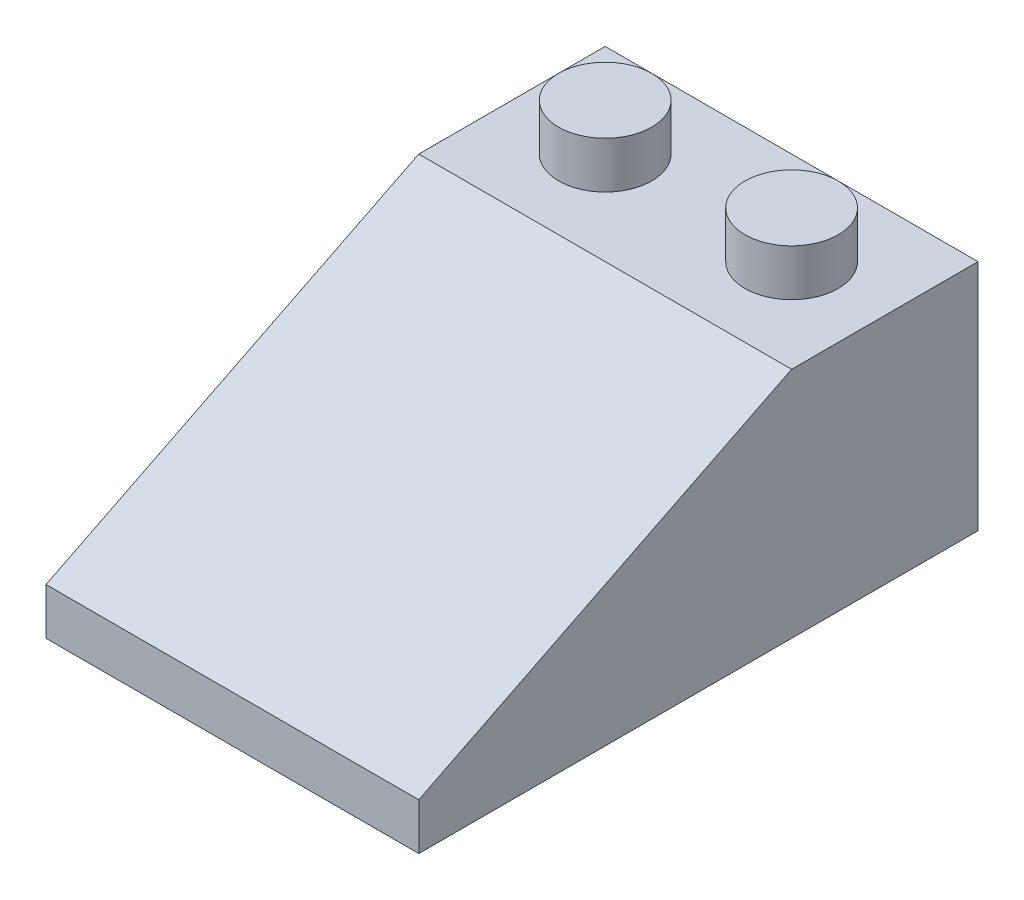
ISO-10303-21;
HEADER;
FILE_DESCRIPTION(('STEP AP214'),'2;1');
FILE_NAME('part.step','',(''),(''),'','','');
FILE_SCHEMA(('AUTOMOTIVE_DESIGN { 1 0 10303 214 1 1 1 1 }'));
ENDSEC;
DATA;
#1=APPLICATION_CONTEXT('core data for automotive mechanical design processes');
#2=APPLICATION_PROTOCOL_DEFINITION('international standard','automotive_design',2000,#1);
#3=PRODUCT_CONTEXT('',#1,'mechanical');
#4=PRODUCT('Part','Part','',(#3));
#5=PRODUCT_RELATED_PRODUCT_CATEGORY('part','',(#4));
#6=PRODUCT_DEFINITION_FORMATION('','',#4);
#7=PRODUCT_DEFINITION_CONTEXT('part definition',#1,'design');
#8=PRODUCT_DEFINITION('design','',#6,#7);
#9=PRODUCT_DEFINITION_SHAPE('','',#8);
#10=(LENGTH_UNIT() NAMED_UNIT(*) SI_UNIT(.MILLI.,.METRE.));
#11=(NAMED_UNIT(*) PLANE_ANGLE_UNIT() SI_UNIT($,.RADIAN.));
#12=(NAMED_UNIT(*) SI_UNIT($,.STERADIAN.) SOLID_ANGLE_UNIT());
#13=UNCERTAINTY_MEASURE_WITH_UNIT(LENGTH_MEASURE(1.E-05),#10,'distance_accuracy_value','');
#14=(GEOMETRIC_REPRESENTATION_CONTEXT(3) GLOBAL_UNCERTAINTY_ASSIGNED_CONTEXT((#13)) GLOBAL_UNIT_ASSIGNED_CONTEXT((#10,
#11,#12)) REPRESENTATION_CONTEXT('',''));
#15=CARTESIAN_POINT('',(0.,0.,0.));
#16=DIRECTION('',(0.,0.,1.));
#17=DIRECTION('',(1.,0.,0.));
#18=AXIS2_PLACEMENT_3D('',#15,#16,#17);
#19=CARTESIAN_POINT('',(16.,0.,24.));
#20=DIRECTION('',(0.,1.,0.));
#21=DIRECTION('',(0.,0.,1.));
#22=AXIS2_PLACEMENT_3D('',#19,#20,#21);
#23=PLANE('',#22);
#24=DIRECTION('',(0.,0.,-1.));
#25=VECTOR('',#24,1.);
#26=CARTESIAN_POINT('',(0.,0.,24.));
#27=LINE('',#26,#25);
#28=CARTESIAN_POINT('',(0.,0.,24.));
#29=VERTEX_POINT('',#28);
#30=CARTESIAN_POINT('',(0.,0.,0.));
#31=VERTEX_POINT('',#30);
#32=EDGE_CURVE('E248',#29,#31,#27,.T.);
#33=ORIENTED_EDGE('',*,*,#32,.T.);
#34=DIRECTION('',(-1.,0.,0.));
#35=VECTOR('',#34,1.);
#36=CARTESIAN_POINT('',(16.,0.,0.));
#37=LINE('',#36,#35);
#38=CARTESIAN_POINT('',(16.,0.,0.));
#39=VERTEX_POINT('',#38);
#40=EDGE_CURVE('E270',#39,#31,#37,.T.);
#41=ORIENTED_EDGE('',*,*,#40,.F.);
#42=DIRECTION('',(0.,0.,-1.));
#43=VECTOR('',#42,1.);
#44=CARTESIAN_POINT('',(16.,0.,24.));
#45=LINE('',#44,#43);
#46=CARTESIAN_POINT('',(16.,0.,24.));
#47=VERTEX_POINT('',#46);
#48=EDGE_CURVE('E231',#47,#39,#45,.T.);
#49=ORIENTED_EDGE('',*,*,#48,.F.);
#50=DIRECTION('',(-1.,0.,0.));
#51=VECTOR('',#50,1.);
#52=CARTESIAN_POINT('',(16.,0.,24.));
#53=LINE('',#52,#51);
#54=EDGE_CURVE('E274',#47,#29,#53,.T.);
#55=ORIENTED_EDGE('',*,*,#54,.T.);
#56=EDGE_LOOP('',(#33,#41,#49,#55));
#57=FACE_BOUND('',#56,.T.);
#58=DIRECTION('',(0.,0.,-1.));
#59=VECTOR('',#58,1.);
#60=CARTESIAN_POINT('',(1.,0.,24.));
#61=LINE('',#60,#59);
#62=CARTESIAN_POINT('',(1.,0.,23.));
#63=VERTEX_POINT('',#62);
#64=CARTESIAN_POINT('',(1.,0.,1.));
#65=VERTEX_POINT('',#64);
#66=EDGE_CURVE('E194',#63,#65,#61,.T.);
#67=ORIENTED_EDGE('',*,*,#66,.F.);
#68=DIRECTION('',(-1.,0.,0.));
#69=VECTOR('',#68,1.);
#70=CARTESIAN_POINT('',(16.,0.,23.));
#71=LINE('',#70,#69);
#72=CARTESIAN_POINT('',(15.,0.,23.));
#73=VERTEX_POINT('',#72);
#74=EDGE_CURVE('E177',#73,#63,#71,.T.);
#75=ORIENTED_EDGE('',*,*,#74,.F.);
#76=DIRECTION('',(0.,0.,-1.));
#77=VECTOR('',#76,1.);
#78=CARTESIAN_POINT('',(15.,0.,24.));
#79=LINE('',#78,#77);
#80=CARTESIAN_POINT('',(15.,0.,1.));
#81=VERTEX_POINT('',#80);
#82=EDGE_CURVE('E197',#73,#81,#79,.T.);
#83=ORIENTED_EDGE('',*,*,#82,.T.);
#84=DIRECTION('',(-1.,0.,0.));
#85=VECTOR('',#84,1.);
#86=CARTESIAN_POINT('',(16.,0.,1.));
#87=LINE('',#86,#85);
#88=EDGE_CURVE('E191',#81,#65,#87,.T.);
#89=ORIENTED_EDGE('',*,*,#88,.T.);
#90=EDGE_LOOP('',(#67,#75,#83,#89));
#91=FACE_BOUND('',#90,.T.);
#92=ADVANCED_FACE('F53',(#57,#91),#23,.F.);
#93=CARTESIAN_POINT('',(16.,2.,24.));
#94=DIRECTION('',(0.,0.,-1.));
#95=DIRECTION('',(-1.,0.,0.));
#96=AXIS2_PLACEMENT_3D('',#93,#94,#95);
#97=PLANE('',#96);
#98=DIRECTION('',(0.,-1.,0.));
#99=VECTOR('',#98,1.);
#100=CARTESIAN_POINT('',(0.,2.,24.));
#101=LINE('',#100,#99);
#102=CARTESIAN_POINT('',(0.,2.,24.));
#103=VERTEX_POINT('',#102);
#104=EDGE_CURVE('E226',#103,#29,#101,.T.);
#105=ORIENTED_EDGE('',*,*,#104,.T.);
#106=ORIENTED_EDGE('',*,*,#54,.F.);
#107=DIRECTION('',(0.,-1.,0.));
#108=VECTOR('',#107,1.);
#109=CARTESIAN_POINT('',(16.,2.,24.));
#110=LINE('',#109,#108);
#111=CARTESIAN_POINT('',(16.,2.,24.));
#112=VERTEX_POINT('',#111);
#113=EDGE_CURVE('E227',#112,#47,#110,.T.);
#114=ORIENTED_EDGE('',*,*,#113,.F.);
#115=DIRECTION('',(-1.,0.,0.));
#116=VECTOR('',#115,1.);
#117=CARTESIAN_POINT('',(16.,2.,24.));
#118=LINE('',#117,#116);
#119=EDGE_CURVE('E244',#112,#103,#118,.T.);
#120=ORIENTED_EDGE('',*,*,#119,.T.);
#121=EDGE_LOOP('',(#105,#106,#114,#120));
#122=FACE_BOUND('',#121,.T.);
#123=ADVANCED_FACE('F55',(#122),#97,.F.);
#124=CARTESIAN_POINT('',(16.,0.,0.));
#125=DIRECTION('',(0.,0.,1.));
#126=DIRECTION('',(1.,0.,0.));
#127=AXIS2_PLACEMENT_3D('',#124,#125,#126);
#128=PLANE('',#127);
#129=DIRECTION('',(0.,1.,0.));
#130=VECTOR('',#129,1.);
#131=CARTESIAN_POINT('',(0.,0.,0.));
#132=LINE('',#131,#130);
#133=CARTESIAN_POINT('',(0.,10.,0.));
#134=VERTEX_POINT('',#133);
#135=EDGE_CURVE('E251',#31,#134,#132,.T.);
#136=ORIENTED_EDGE('',*,*,#135,.T.);
#137=DIRECTION('',(-1.,0.,0.));
#138=VECTOR('',#137,1.);
#139=CARTESIAN_POINT('',(16.,10.,0.));
#140=LINE('',#139,#138);
#141=CARTESIAN_POINT('',(16.,10.,0.));
#142=VERTEX_POINT('',#141);
#143=EDGE_CURVE('E266',#142,#134,#140,.T.);
#144=ORIENTED_EDGE('',*,*,#143,.F.);
#145=DIRECTION('',(0.,1.,0.));
#146=VECTOR('',#145,1.);
#147=CARTESIAN_POINT('',(16.,0.,0.));
#148=LINE('',#147,#146);
#149=EDGE_CURVE('E235',#39,#142,#148,.T.);
#150=ORIENTED_EDGE('',*,*,#149,.F.);
#151=ORIENTED_EDGE('',*,*,#40,.T.);
#152=EDGE_LOOP('',(#136,#144,#150,#151));
#153=FACE_BOUND('',#152,.T.);
#154=ADVANCED_FACE('F291',(#153),#128,.F.);
#155=CARTESIAN_POINT('',(16.,10.,0.));
#156=DIRECTION('',(0.,-1.,0.));
#157=DIRECTION('',(0.,0.,-1.));
#158=AXIS2_PLACEMENT_3D('',#155,#156,#157);
#159=PLANE('',#158);
#160=CARTESIAN_POINT('',(12.,10.,4.00000000000001));
#161=DIRECTION('',(0.,-1.,0.));
#162=DIRECTION('',(0.,0.,-1.));
#163=AXIS2_PLACEMENT_3D('',#160,#161,#162);
#164=CIRCLE('',#163,2.);
#165=CARTESIAN_POINT('',(12.,10.,2.00000000000001));
#166=VERTEX_POINT('',#165);
#167=EDGE_CURVE('E62',#166,#166,#164,.F.);
#168=ORIENTED_EDGE('',*,*,#167,.F.);
#169=EDGE_LOOP('',(#168));
#170=FACE_BOUND('',#169,.T.);
#171=CARTESIAN_POINT('',(4.,10.,4.00000000000001));
#172=DIRECTION('',(0.,-1.,0.));
#173=DIRECTION('',(0.,0.,-1.));
#174=AXIS2_PLACEMENT_3D('',#171,#172,#173);
#175=CIRCLE('',#174,2.);
#176=CARTESIAN_POINT('',(4.,10.,2.));
#177=VERTEX_POINT('',#176);
#178=EDGE_CURVE('E278',#177,#177,#175,.F.);
#179=ORIENTED_EDGE('',*,*,#178,.F.);
#180=EDGE_LOOP('',(#179));
#181=FACE_BOUND('',#180,.T.);
#182=DIRECTION('',(0.,0.,1.));
#183=VECTOR('',#182,1.);
#184=CARTESIAN_POINT('',(0.,10.,0.));
#185=LINE('',#184,#183);
#186=CARTESIAN_POINT('',(0.,10.,8.));
#187=VERTEX_POINT('',#186);
#188=EDGE_CURVE('E254',#134,#187,#185,.T.);
#189=ORIENTED_EDGE('',*,*,#188,.T.);
#190=DIRECTION('',(-1.,0.,0.));
#191=VECTOR('',#190,1.);
#192=CARTESIAN_POINT('',(16.,10.,8.));
#193=LINE('',#192,#191);
#194=CARTESIAN_POINT('',(16.,10.,8.));
#195=VERTEX_POINT('',#194);
#196=EDGE_CURVE('E262',#195,#187,#193,.T.);
#197=ORIENTED_EDGE('',*,*,#196,.F.);
#198=DIRECTION('',(0.,0.,1.));
#199=VECTOR('',#198,1.);
#200=CARTESIAN_POINT('',(16.,10.,0.));
#201=LINE('',#200,#199);
#202=EDGE_CURVE('E238',#142,#195,#201,.T.);
#203=ORIENTED_EDGE('',*,*,#202,.F.);
#204=ORIENTED_EDGE('',*,*,#143,.T.);
#205=EDGE_LOOP('',(#189,#197,#203,#204));
#206=FACE_BOUND('',#205,.T.);
#207=ADVANCED_FACE('F287',(#170,#181,#206),#159,.F.);
#208=CARTESIAN_POINT('',(16.,10.,8.));
#209=DIRECTION('',(0.,-0.894427190999916,-0.447213595499958));
#210=DIRECTION('',(0.,0.447213595499958,-0.894427190999916));
#211=AXIS2_PLACEMENT_3D('',#208,#209,#210);
#212=PLANE('',#211);
#213=DIRECTION('',(0.,-0.447213595499958,0.894427190999916));
#214=VECTOR('',#213,1.);
#215=CARTESIAN_POINT('',(0.,10.,8.));
#216=LINE('',#215,#214);
#217=EDGE_CURVE('E232',#187,#103,#216,.T.);
#218=ORIENTED_EDGE('',*,*,#217,.T.);
#219=ORIENTED_EDGE('',*,*,#119,.F.);
#220=DIRECTION('',(0.,-0.447213595499958,0.894427190999916));
#221=VECTOR('',#220,1.);
#222=CARTESIAN_POINT('',(16.,10.,8.));
#223=LINE('',#222,#221);
#224=EDGE_CURVE('E241',#195,#112,#223,.T.);
#225=ORIENTED_EDGE('',*,*,#224,.F.);
#226=ORIENTED_EDGE('',*,*,#196,.T.);
#227=EDGE_LOOP('',(#218,#219,#225,#226));
#228=FACE_BOUND('',#227,.T.);
#229=ADVANCED_FACE('F290',(#228),#212,.F.);
#230=CARTESIAN_POINT('',(16.,0.,0.));
#231=DIRECTION('',(1.,0.,0.));
#232=DIRECTION('',(0.,0.,-1.));
#233=AXIS2_PLACEMENT_3D('',#230,#231,#232);
#234=PLANE('',#233);
#235=ORIENTED_EDGE('',*,*,#113,.T.);
#236=ORIENTED_EDGE('',*,*,#48,.T.);
#237=ORIENTED_EDGE('',*,*,#149,.T.);
#238=ORIENTED_EDGE('',*,*,#202,.T.);
#239=ORIENTED_EDGE('',*,*,#224,.T.);
#240=EDGE_LOOP('',(#235,#236,#237,#238,#239));
#241=FACE_BOUND('',#240,.T.);
#242=ADVANCED_FACE('F311',(#241),#234,.T.);
#243=CARTESIAN_POINT('',(0.,0.,0.));
#244=DIRECTION('',(1.,0.,0.));
#245=DIRECTION('',(0.,0.,-1.));
#246=AXIS2_PLACEMENT_3D('',#243,#244,#245);
#247=PLANE('',#246);
#248=ORIENTED_EDGE('',*,*,#104,.F.);
#249=ORIENTED_EDGE('',*,*,#217,.F.);
#250=ORIENTED_EDGE('',*,*,#188,.F.);
#251=ORIENTED_EDGE('',*,*,#135,.F.);
#252=ORIENTED_EDGE('',*,*,#32,.F.);
#253=EDGE_LOOP('',(#248,#249,#250,#251,#252));
#254=FACE_BOUND('',#253,.T.);
#255=ADVANCED_FACE('F306',(#254),#247,.F.);
#256=CARTESIAN_POINT('',(4.,12.,4.00000000000001));
#257=DIRECTION('',(0.,-1.,0.));
#258=DIRECTION('',(0.,0.,-1.));
#259=AXIS2_PLACEMENT_3D('',#256,#257,#258);
#260=CYLINDRICAL_SURFACE('',#259,2.);
#261=CARTESIAN_POINT('',(4.,12.,4.00000000000001));
#262=DIRECTION('',(0.,1.,0.));
#263=DIRECTION('',(0.,0.,1.));
#264=AXIS2_PLACEMENT_3D('',#261,#262,#263);
#265=CIRCLE('',#264,2.);
#266=CARTESIAN_POINT('',(4.,12.,6.00000000000001));
#267=VERTEX_POINT('',#266);
#268=EDGE_CURVE('E222',#267,#267,#265,.T.);
#269=ORIENTED_EDGE('',*,*,#268,.F.);
#270=EDGE_LOOP('',(#269));
#271=FACE_BOUND('',#270,.T.);
#272=ORIENTED_EDGE('',*,*,#178,.T.);
#273=EDGE_LOOP('',(#272));
#274=FACE_BOUND('',#273,.T.);
#275=ADVANCED_FACE('F443',(#271,#274),#260,.T.);
#276=CARTESIAN_POINT('',(4.,12.,4.00000000000001));
#277=DIRECTION('',(0.,1.,0.));
#278=DIRECTION('',(0.,0.,1.));
#279=AXIS2_PLACEMENT_3D('',#276,#277,#278);
#280=PLANE('',#279);
#281=ORIENTED_EDGE('',*,*,#268,.T.);
#282=EDGE_LOOP('',(#281));
#283=FACE_BOUND('',#282,.T.);
#284=ADVANCED_FACE('F439',(#283),#280,.T.);
#285=CARTESIAN_POINT('',(12.,12.,4.00000000000001));
#286=DIRECTION('',(0.,-1.,0.));
#287=DIRECTION('',(0.,0.,-1.));
#288=AXIS2_PLACEMENT_3D('',#285,#286,#287);
#289=CYLINDRICAL_SURFACE('',#288,2.);
#290=CARTESIAN_POINT('',(12.,12.,4.00000000000001));
#291=DIRECTION('',(0.,1.,0.));
#292=DIRECTION('',(0.,0.,-1.));
#293=AXIS2_PLACEMENT_3D('',#290,#291,#292);
#294=CIRCLE('',#293,2.);
#295=CARTESIAN_POINT('',(12.,12.,2.00000000000001));
#296=VERTEX_POINT('',#295);
#297=EDGE_CURVE('E172',#296,#296,#294,.T.);
#298=ORIENTED_EDGE('',*,*,#297,.F.);
#299=EDGE_LOOP('',(#298));
#300=FACE_BOUND('',#299,.T.);
#301=ORIENTED_EDGE('',*,*,#167,.T.);
#302=EDGE_LOOP('',(#301));
#303=FACE_BOUND('',#302,.T.);
#304=ADVANCED_FACE('F285',(#300,#303),#289,.T.);
#305=CARTESIAN_POINT('',(12.,12.,4.00000000000001));
#306=DIRECTION('',(0.,-1.,0.));
#307=DIRECTION('',(0.,0.,-1.));
#308=AXIS2_PLACEMENT_3D('',#305,#306,#307);
#309=PLANE('',#308);
#310=ORIENTED_EDGE('',*,*,#297,.T.);
#311=EDGE_LOOP('',(#310));
#312=FACE_BOUND('',#311,.T.);
#313=ADVANCED_FACE('F404',(#312),#309,.F.);
#314=CARTESIAN_POINT('',(16.,2.,23.));
#315=DIRECTION('',(0.,0.,-1.));
#316=DIRECTION('',(-1.,0.,0.));
#317=AXIS2_PLACEMENT_3D('',#314,#315,#316);
#318=PLANE('',#317);
#319=DIRECTION('',(0.,-1.,0.));
#320=VECTOR('',#319,1.);
#321=CARTESIAN_POINT('',(1.,2.,23.));
#322=LINE('',#321,#320);
#323=CARTESIAN_POINT('',(1.,1.38196601125011,23.));
#324=VERTEX_POINT('',#323);
#325=EDGE_CURVE('E202',#324,#63,#322,.T.);
#326=ORIENTED_EDGE('',*,*,#325,.F.);
#327=DIRECTION('',(-1.,0.,0.));
#328=VECTOR('',#327,1.);
#329=CARTESIAN_POINT('',(16.,1.38196601125011,23.));
#330=LINE('',#329,#328);
#331=CARTESIAN_POINT('',(15.,1.38196601125011,23.));
#332=VERTEX_POINT('',#331);
#333=EDGE_CURVE('E163',#332,#324,#330,.T.);
#334=ORIENTED_EDGE('',*,*,#333,.F.);
#335=DIRECTION('',(0.,-1.,0.));
#336=VECTOR('',#335,1.);
#337=CARTESIAN_POINT('',(15.,2.,23.));
#338=LINE('',#337,#336);
#339=EDGE_CURVE('E218',#332,#73,#338,.T.);
#340=ORIENTED_EDGE('',*,*,#339,.T.);
#341=ORIENTED_EDGE('',*,*,#74,.T.);
#342=EDGE_LOOP('',(#326,#334,#340,#341));
#343=FACE_BOUND('',#342,.T.);
#344=ADVANCED_FACE('F401',(#343),#318,.T.);
#345=CARTESIAN_POINT('',(16.,0.,1.));
#346=DIRECTION('',(0.,0.,1.));
#347=DIRECTION('',(1.,0.,0.));
#348=AXIS2_PLACEMENT_3D('',#345,#346,#347);
#349=PLANE('',#348);
#350=DIRECTION('',(0.,1.,0.));
#351=VECTOR('',#350,1.);
#352=CARTESIAN_POINT('',(1.,0.,1.));
#353=LINE('',#352,#351);
#354=CARTESIAN_POINT('',(1.,9.,1.));
#355=VERTEX_POINT('',#354);
#356=EDGE_CURVE('E183',#65,#355,#353,.T.);
#357=ORIENTED_EDGE('',*,*,#356,.F.);
#358=ORIENTED_EDGE('',*,*,#88,.F.);
#359=DIRECTION('',(0.,1.,0.));
#360=VECTOR('',#359,1.);
#361=CARTESIAN_POINT('',(15.,0.,1.));
#362=LINE('',#361,#360);
#363=CARTESIAN_POINT('',(15.,9.,1.));
#364=VERTEX_POINT('',#363);
#365=EDGE_CURVE('E187',#81,#364,#362,.T.);
#366=ORIENTED_EDGE('',*,*,#365,.T.);
#367=DIRECTION('',(-1.,0.,0.));
#368=VECTOR('',#367,1.);
#369=CARTESIAN_POINT('',(16.,9.,1.));
#370=LINE('',#369,#368);
#371=EDGE_CURVE('E162',#364,#355,#370,.T.);
#372=ORIENTED_EDGE('',*,*,#371,.T.);
#373=EDGE_LOOP('',(#357,#358,#366,#372));
#374=FACE_BOUND('',#373,.T.);
#375=ADVANCED_FACE('F326',(#374),#349,.T.);
#376=CARTESIAN_POINT('',(16.,9.,0.));
#377=DIRECTION('',(0.,-1.,0.));
#378=DIRECTION('',(0.,0.,-1.));
#379=AXIS2_PLACEMENT_3D('',#376,#377,#378);
#380=PLANE('',#379);
#381=CARTESIAN_POINT('',(8.,9.,8.));
#382=DIRECTION('',(0.,-1.,0.));
#383=DIRECTION('',(0.,0.,-1.));
#384=AXIS2_PLACEMENT_3D('',#381,#382,#383);
#385=CIRCLE('',#384,2.7);
#386=CARTESIAN_POINT('',(10.6896601848559,9.,7.76393202250021));
#387=VERTEX_POINT('',#386);
#388=CARTESIAN_POINT('',(5.31033981514409,9.,7.76393202250021));
#389=VERTEX_POINT('',#388);
#390=EDGE_CURVE('E207',#387,#389,#385,.F.);
#391=ORIENTED_EDGE('',*,*,#390,.T.);
#392=DIRECTION('',(-1.,0.,0.));
#393=VECTOR('',#392,1.);
#394=CARTESIAN_POINT('',(16.,9.,7.76393202250021));
#395=LINE('',#394,#393);
#396=CARTESIAN_POINT('',(1.,9.,7.76393202250021));
#397=VERTEX_POINT('',#396);
#398=EDGE_CURVE('E158',#389,#397,#395,.T.);
#399=ORIENTED_EDGE('',*,*,#398,.T.);
#400=DIRECTION('',(0.,0.,1.));
#401=VECTOR('',#400,1.);
#402=CARTESIAN_POINT('',(1.,9.,0.));
#403=LINE('',#402,#401);
#404=EDGE_CURVE('E178',#355,#397,#403,.T.);
#405=ORIENTED_EDGE('',*,*,#404,.F.);
#406=ORIENTED_EDGE('',*,*,#371,.F.);
#407=DIRECTION('',(0.,0.,1.));
#408=VECTOR('',#407,1.);
#409=CARTESIAN_POINT('',(15.,9.,0.));
#410=LINE('',#409,#408);
#411=CARTESIAN_POINT('',(15.,9.,7.76393202250021));
#412=VERTEX_POINT('',#411);
#413=EDGE_CURVE('E184',#364,#412,#410,.T.);
#414=ORIENTED_EDGE('',*,*,#413,.T.);
#415=EDGE_CURVE('E157',#412,#387,#395,.T.);
#416=ORIENTED_EDGE('',*,*,#415,.T.);
#417=EDGE_LOOP('',(#391,#399,#405,#406,#414,#416));
#418=FACE_BOUND('',#417,.T.);
#419=CARTESIAN_POINT('',(12.,9.,4.));
#420=DIRECTION('',(0.,-1.,0.));
#421=DIRECTION('',(0.,0.,-1.));
#422=AXIS2_PLACEMENT_3D('',#419,#420,#421);
#423=CIRCLE('',#422,1.);
#424=CARTESIAN_POINT('',(12.,9.,3.));
#425=VERTEX_POINT('',#424);
#426=EDGE_CURVE('E168',#425,#425,#423,.F.);
#427=ORIENTED_EDGE('',*,*,#426,.T.);
#428=EDGE_LOOP('',(#427));
#429=FACE_BOUND('',#428,.T.);
#430=CARTESIAN_POINT('',(4.,9.,4.));
#431=DIRECTION('',(0.,-1.,0.));
#432=DIRECTION('',(0.,0.,-1.));
#433=AXIS2_PLACEMENT_3D('',#430,#431,#432);
#434=CIRCLE('',#433,1.);
#435=CARTESIAN_POINT('',(4.,9.,3.));
#436=VERTEX_POINT('',#435);
#437=EDGE_CURVE('E173',#436,#436,#434,.F.);
#438=ORIENTED_EDGE('',*,*,#437,.T.);
#439=EDGE_LOOP('',(#438));
#440=FACE_BOUND('',#439,.T.);
#441=ADVANCED_FACE('F333',(#418,#429,#440),#380,.T.);
#442=CARTESIAN_POINT('',(16.,9.10557280900008,7.55278640450004));
#443=DIRECTION('',(0.,-0.894427190999916,-0.447213595499958));
#444=DIRECTION('',(0.,0.447213595499958,-0.894427190999916));
#445=AXIS2_PLACEMENT_3D('',#442,#443,#444);
#446=PLANE('',#445);
#447=CARTESIAN_POINT('',(8.,4.88196601125011,16.));
#448=DIRECTION('',(0.,-0.894427190999916,-0.447213595499958));
#449=DIRECTION('',(0.,-0.447213595499958,0.894427190999916));
#450=AXIS2_PLACEMENT_3D('',#447,#448,#449);
#451=ELLIPSE('',#450,3.01869176962471,2.7);
#452=CARTESIAN_POINT('',(8.,3.53196601125011,18.7));
#453=VERTEX_POINT('',#452);
#454=EDGE_CURVE('E12',#453,#453,#451,.T.);
#455=ORIENTED_EDGE('',*,*,#454,.F.);
#456=EDGE_LOOP('',(#455));
#457=FACE_BOUND('',#456,.T.);
#458=CARTESIAN_POINT('',(8.,8.88196601125011,8.));
#459=DIRECTION('',(0.,-0.894427190999916,-0.447213595499958));
#460=DIRECTION('',(0.,-0.447213595499958,0.894427190999916));
#461=AXIS2_PLACEMENT_3D('',#458,#459,#460);
#462=ELLIPSE('',#461,3.01869176962472,2.7);
#463=EDGE_CURVE('E76',#389,#387,#462,.F.);
#464=ORIENTED_EDGE('',*,*,#463,.T.);
#465=ORIENTED_EDGE('',*,*,#415,.F.);
#466=DIRECTION('',(0.,-0.447213595499958,0.894427190999916));
#467=VECTOR('',#466,1.);
#468=CARTESIAN_POINT('',(15.,9.10557280900008,7.55278640450004));
#469=LINE('',#468,#467);
#470=EDGE_CURVE('E166',#412,#332,#469,.T.);
#471=ORIENTED_EDGE('',*,*,#470,.T.);
#472=ORIENTED_EDGE('',*,*,#333,.T.);
#473=DIRECTION('',(0.,-0.447213595499958,0.894427190999916));
#474=VECTOR('',#473,1.);
#475=CARTESIAN_POINT('',(1.,9.10557280900008,7.55278640450004));
#476=LINE('',#475,#474);
#477=EDGE_CURVE('E182',#397,#324,#476,.T.);
#478=ORIENTED_EDGE('',*,*,#477,.F.);
#479=ORIENTED_EDGE('',*,*,#398,.F.);
#480=EDGE_LOOP('',(#464,#465,#471,#472,#478,#479));
#481=FACE_BOUND('',#480,.T.);
#482=ADVANCED_FACE('F337',(#457,#481),#446,.T.);
#483=CARTESIAN_POINT('',(15.,0.,0.));
#484=DIRECTION('',(1.,0.,0.));
#485=DIRECTION('',(0.,0.,-1.));
#486=AXIS2_PLACEMENT_3D('',#483,#484,#485);
#487=PLANE('',#486);
#488=ORIENTED_EDGE('',*,*,#339,.F.);
#489=ORIENTED_EDGE('',*,*,#470,.F.);
#490=ORIENTED_EDGE('',*,*,#413,.F.);
#491=ORIENTED_EDGE('',*,*,#365,.F.);
#492=ORIENTED_EDGE('',*,*,#82,.F.);
#493=EDGE_LOOP('',(#488,#489,#490,#491,#492));
#494=FACE_BOUND('',#493,.T.);
#495=ADVANCED_FACE('F412',(#494),#487,.F.);
#496=CARTESIAN_POINT('',(1.,0.,0.));
#497=DIRECTION('',(1.,0.,0.));
#498=DIRECTION('',(0.,0.,-1.));
#499=AXIS2_PLACEMENT_3D('',#496,#497,#498);
#500=PLANE('',#499);
#501=ORIENTED_EDGE('',*,*,#325,.T.);
#502=ORIENTED_EDGE('',*,*,#66,.T.);
#503=ORIENTED_EDGE('',*,*,#356,.T.);
#504=ORIENTED_EDGE('',*,*,#404,.T.);
#505=ORIENTED_EDGE('',*,*,#477,.T.);
#506=EDGE_LOOP('',(#501,#502,#503,#504,#505));
#507=FACE_BOUND('',#506,.T.);
#508=ADVANCED_FACE('F323',(#507),#500,.T.);
#509=CARTESIAN_POINT('',(4.,12.,4.00000000000001));
#510=DIRECTION('',(0.,-1.,0.));
#511=DIRECTION('',(0.,0.,-1.));
#512=AXIS2_PLACEMENT_3D('',#509,#510,#511);
#513=CYLINDRICAL_SURFACE('',#512,1.);
#514=CARTESIAN_POINT('',(4.,11.,4.00000000000001));
#515=DIRECTION('',(0.,1.,0.));
#516=DIRECTION('',(0.,0.,1.));
#517=AXIS2_PLACEMENT_3D('',#514,#515,#516);
#518=CIRCLE('',#517,1.);
#519=CARTESIAN_POINT('',(4.,11.,5.00000000000001));
#520=VERTEX_POINT('',#519);
#521=EDGE_CURVE('E198',#520,#520,#518,.T.);
#522=ORIENTED_EDGE('',*,*,#521,.T.);
#523=EDGE_LOOP('',(#522));
#524=FACE_BOUND('',#523,.T.);
#525=ORIENTED_EDGE('',*,*,#437,.F.);
#526=EDGE_LOOP('',(#525));
#527=FACE_BOUND('',#526,.T.);
#528=ADVANCED_FACE('F419',(#524,#527),#513,.F.);
#529=CARTESIAN_POINT('',(4.,11.,4.00000000000001));
#530=DIRECTION('',(0.,1.,0.));
#531=DIRECTION('',(0.,0.,1.));
#532=AXIS2_PLACEMENT_3D('',#529,#530,#531);
#533=PLANE('',#532);
#534=ORIENTED_EDGE('',*,*,#521,.F.);
#535=EDGE_LOOP('',(#534));
#536=FACE_BOUND('',#535,.T.);
#537=ADVANCED_FACE('F422',(#536),#533,.F.);
#538=CARTESIAN_POINT('',(12.,12.,4.00000000000001));
#539=DIRECTION('',(0.,-1.,0.));
#540=DIRECTION('',(0.,0.,-1.));
#541=AXIS2_PLACEMENT_3D('',#538,#539,#540);
#542=CYLINDRICAL_SURFACE('',#541,1.);
#543=CARTESIAN_POINT('',(12.,11.,4.00000000000001));
#544=DIRECTION('',(0.,-1.,0.));
#545=DIRECTION('',(0.,0.,-1.));
#546=AXIS2_PLACEMENT_3D('',#543,#544,#545);
#547=CIRCLE('',#546,1.);
#548=CARTESIAN_POINT('',(12.,11.,3.00000000000001));
#549=VERTEX_POINT('',#548);
#550=EDGE_CURVE('E203',#549,#549,#547,.F.);
#551=ORIENTED_EDGE('',*,*,#550,.T.);
#552=EDGE_LOOP('',(#551));
#553=FACE_BOUND('',#552,.T.);
#554=ORIENTED_EDGE('',*,*,#426,.F.);
#555=EDGE_LOOP('',(#554));
#556=FACE_BOUND('',#555,.T.);
#557=ADVANCED_FACE('F426',(#553,#556),#542,.F.);
#558=CARTESIAN_POINT('',(12.,11.,4.00000000000001));
#559=DIRECTION('',(0.,-1.,0.));
#560=DIRECTION('',(0.,0.,-1.));
#561=AXIS2_PLACEMENT_3D('',#558,#559,#560);
#562=PLANE('',#561);
#563=ORIENTED_EDGE('',*,*,#550,.F.);
#564=EDGE_LOOP('',(#563));
#565=FACE_BOUND('',#564,.T.);
#566=ADVANCED_FACE('F394',(#565),#562,.T.);
#567=CARTESIAN_POINT('',(8.,0.,8.));
#568=DIRECTION('',(0.,-1.,0.));
#569=DIRECTION('',(0.,0.,-1.));
#570=AXIS2_PLACEMENT_3D('',#567,#568,#569);
#571=PLANE('',#570);
#572=CARTESIAN_POINT('',(8.,0.,8.));
#573=DIRECTION('',(0.,-1.,0.));
#574=DIRECTION('',(0.,0.,-1.));
#575=AXIS2_PLACEMENT_3D('',#572,#573,#574);
#576=CIRCLE('',#575,1.7);
#577=CARTESIAN_POINT('',(8.,0.,6.3));
#578=VERTEX_POINT('',#577);
#579=EDGE_CURVE('E153',#578,#578,#576,.T.);
#580=ORIENTED_EDGE('',*,*,#579,.F.);
#581=EDGE_LOOP('',(#580));
#582=FACE_BOUND('',#581,.T.);
#583=CARTESIAN_POINT('',(8.,0.,8.));
#584=DIRECTION('',(0.,-1.,0.));
#585=DIRECTION('',(0.,0.,-1.));
#586=AXIS2_PLACEMENT_3D('',#583,#584,#585);
#587=CIRCLE('',#586,2.7);
#588=CARTESIAN_POINT('',(8.,0.,5.3));
#589=VERTEX_POINT('',#588);
#590=EDGE_CURVE('E351',#589,#589,#587,.T.);
#591=ORIENTED_EDGE('',*,*,#590,.T.);
#592=EDGE_LOOP('',(#591));
#593=FACE_BOUND('',#592,.T.);
#594=ADVANCED_FACE('F390',(#582,#593),#571,.T.);
#595=CARTESIAN_POINT('',(8.,12.002,8.));
#596=DIRECTION('',(0.,-1.,0.));
#597=DIRECTION('',(0.,0.,-1.));
#598=AXIS2_PLACEMENT_3D('',#595,#596,#597);
#599=CYLINDRICAL_SURFACE('',#598,2.7);
#600=ORIENTED_EDGE('',*,*,#463,.F.);
#601=ORIENTED_EDGE('',*,*,#390,.F.);
#602=EDGE_LOOP('',(#600,#601));
#603=FACE_BOUND('',#602,.T.);
#604=ORIENTED_EDGE('',*,*,#590,.F.);
#605=EDGE_LOOP('',(#604));
#606=FACE_BOUND('',#605,.T.);
#607=ADVANCED_FACE('F393',(#603,#606),#599,.T.);
#608=CARTESIAN_POINT('',(8.,12.002,8.));
#609=DIRECTION('',(0.,-1.,0.));
#610=DIRECTION('',(0.,0.,-1.));
#611=AXIS2_PLACEMENT_3D('',#608,#609,#610);
#612=CYLINDRICAL_SURFACE('',#611,1.7);
#613=CARTESIAN_POINT('',(8.,9.,8.));
#614=DIRECTION('',(0.,-1.,0.));
#615=DIRECTION('',(0.,0.,-1.));
#616=AXIS2_PLACEMENT_3D('',#613,#614,#615);
#617=CIRCLE('',#616,1.7);
#618=CARTESIAN_POINT('',(9.68352959878915,9.,7.76393202250021));
#619=VERTEX_POINT('',#618);
#620=CARTESIAN_POINT('',(6.31647040121086,9.,7.76393202250021));
#621=VERTEX_POINT('',#620);
#622=EDGE_CURVE('E68',#619,#621,#617,.F.);
#623=ORIENTED_EDGE('',*,*,#622,.T.);
#624=CARTESIAN_POINT('',(8.,8.88196601125011,8.));
#625=DIRECTION('',(0.,-0.894427190999916,-0.447213595499958));
#626=DIRECTION('',(0.,-0.447213595499958,0.894427190999916));
#627=AXIS2_PLACEMENT_3D('',#624,#625,#626);
#628=ELLIPSE('',#627,1.90065778087482,1.7);
#629=EDGE_CURVE('E141',#621,#619,#628,.F.);
#630=ORIENTED_EDGE('',*,*,#629,.T.);
#631=EDGE_LOOP('',(#623,#630));
#632=FACE_BOUND('',#631,.T.);
#633=ORIENTED_EDGE('',*,*,#579,.T.);
#634=EDGE_LOOP('',(#633));
#635=FACE_BOUND('',#634,.T.);
#636=ADVANCED_FACE('F142',(#632,#635),#612,.F.);
#637=EDGE_CURVE('E151',#619,#621,#395,.T.);
#638=ORIENTED_EDGE('',*,*,#637,.F.);
#639=ORIENTED_EDGE('',*,*,#629,.F.);
#640=EDGE_LOOP('',(#638,#639));
#641=FACE_BOUND('',#640,.T.);
#642=ADVANCED_FACE('F155',(#641),#446,.T.);
#643=ORIENTED_EDGE('',*,*,#637,.T.);
#644=ORIENTED_EDGE('',*,*,#622,.F.);
#645=EDGE_LOOP('',(#643,#644));
#646=FACE_BOUND('',#645,.T.);
#647=ADVANCED_FACE('F150',(#646),#380,.T.);
#648=CARTESIAN_POINT('',(8.,0.,16.));
#649=DIRECTION('',(0.,1.,0.));
#650=DIRECTION('',(0.,0.,1.));
#651=AXIS2_PLACEMENT_3D('',#648,#649,#650);
#652=PLANE('',#651);
#653=CARTESIAN_POINT('',(8.,0.,16.));
#654=DIRECTION('',(0.,-1.,0.));
#655=DIRECTION('',(0.,0.,1.));
#656=AXIS2_PLACEMENT_3D('',#653,#654,#655);
#657=CIRCLE('',#656,1.7);
#658=CARTESIAN_POINT('',(8.,0.,17.7));
#659=VERTEX_POINT('',#658);
#660=EDGE_CURVE('E362',#659,#659,#657,.T.);
#661=ORIENTED_EDGE('',*,*,#660,.F.);
#662=EDGE_LOOP('',(#661));
#663=FACE_BOUND('',#662,.T.);
#664=CARTESIAN_POINT('',(8.,0.,16.));
#665=DIRECTION('',(0.,-1.,0.));
#666=DIRECTION('',(0.,0.,1.));
#667=AXIS2_PLACEMENT_3D('',#664,#665,#666);
#668=CIRCLE('',#667,2.7);
#669=CARTESIAN_POINT('',(8.,0.,18.7));
#670=VERTEX_POINT('',#669);
#671=EDGE_CURVE('E363',#670,#670,#668,.T.);
#672=ORIENTED_EDGE('',*,*,#671,.T.);
#673=EDGE_LOOP('',(#672));
#674=FACE_BOUND('',#673,.T.);
#675=ADVANCED_FACE('F373',(#663,#674),#652,.F.);
#676=CARTESIAN_POINT('',(8.,12.002,16.));
#677=DIRECTION('',(0.,-1.,0.));
#678=DIRECTION('',(0.,0.,-1.));
#679=AXIS2_PLACEMENT_3D('',#676,#677,#678);
#680=CYLINDRICAL_SURFACE('',#679,2.7);
#681=ORIENTED_EDGE('',*,*,#454,.T.);
#682=EDGE_LOOP('',(#681));
#683=FACE_BOUND('',#682,.T.);
#684=ORIENTED_EDGE('',*,*,#671,.F.);
#685=EDGE_LOOP('',(#684));
#686=FACE_BOUND('',#685,.T.);
#687=ADVANCED_FACE('F376',(#683,#686),#680,.T.);
#688=CARTESIAN_POINT('',(8.,12.002,16.));
#689=DIRECTION('',(0.,-1.,0.));
#690=DIRECTION('',(0.,0.,-1.));
#691=AXIS2_PLACEMENT_3D('',#688,#689,#690);
#692=CYLINDRICAL_SURFACE('',#691,1.7);
#693=CARTESIAN_POINT('',(8.,4.88196601125011,16.));
#694=DIRECTION('',(0.,-0.894427190999916,-0.447213595499958));
#695=DIRECTION('',(0.,-0.447213595499958,0.894427190999916));
#696=AXIS2_PLACEMENT_3D('',#693,#694,#695);
#697=ELLIPSE('',#696,1.90065778087482,1.7);
#698=CARTESIAN_POINT('',(8.,4.03196601125011,17.7));
#699=VERTEX_POINT('',#698);
#700=EDGE_CURVE('E355',#699,#699,#697,.F.);
#701=ORIENTED_EDGE('',*,*,#700,.T.);
#702=EDGE_LOOP('',(#701));
#703=FACE_BOUND('',#702,.T.);
#704=ORIENTED_EDGE('',*,*,#660,.T.);
#705=EDGE_LOOP('',(#704));
#706=FACE_BOUND('',#705,.T.);
#707=ADVANCED_FACE('F371',(#703,#706),#692,.F.);
#708=ORIENTED_EDGE('',*,*,#700,.F.);
#709=EDGE_LOOP('',(#708));
#710=FACE_BOUND('',#709,.T.);
#711=ADVANCED_FACE('F378',(#710),#446,.T.);
#712=CLOSED_SHELL('',(#92,#123,#154,#207,#229,#242,#255,#275,#284,#304,#313,#344,#375,#441,#482,
#495,#508,#528,#537,#557,#566,#594,#607,#636,#642,#647,#675,#687,#707,#711));
#713=MANIFOLD_SOLID_BREP('B2',#712);
#714=ADVANCED_BREP_SHAPE_REPRESENTATION('',(#18,#713),#14);
#715=SHAPE_DEFINITION_REPRESENTATION(#9,#714);
ENDSEC;
END-ISO-10303-21;
